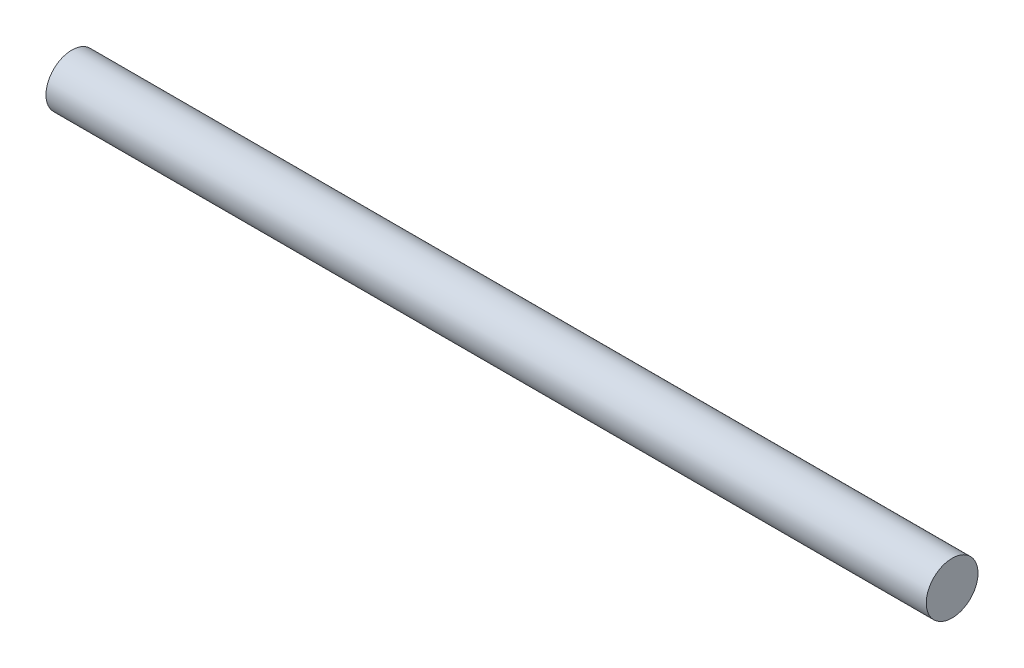
ISO-10303-21;
HEADER;
FILE_DESCRIPTION(('STEP AP214'),'2;1');
FILE_NAME('part.step','',(''),(''),'','','');
FILE_SCHEMA(('AUTOMOTIVE_DESIGN { 1 0 10303 214 1 1 1 1 }'));
ENDSEC;
DATA;
#1=APPLICATION_CONTEXT('core data for automotive mechanical design processes');
#2=APPLICATION_PROTOCOL_DEFINITION('international standard','automotive_design',2000,#1);
#3=PRODUCT_CONTEXT('',#1,'mechanical');
#4=PRODUCT('Part','Part','',(#3));
#5=PRODUCT_RELATED_PRODUCT_CATEGORY('part','',(#4));
#6=PRODUCT_DEFINITION_FORMATION('','',#4);
#7=PRODUCT_DEFINITION_CONTEXT('part definition',#1,'design');
#8=PRODUCT_DEFINITION('design','',#6,#7);
#9=PRODUCT_DEFINITION_SHAPE('','',#8);
#10=(LENGTH_UNIT() NAMED_UNIT(*) SI_UNIT(.MILLI.,.METRE.));
#11=(NAMED_UNIT(*) PLANE_ANGLE_UNIT() SI_UNIT($,.RADIAN.));
#12=(NAMED_UNIT(*) SI_UNIT($,.STERADIAN.) SOLID_ANGLE_UNIT());
#13=UNCERTAINTY_MEASURE_WITH_UNIT(LENGTH_MEASURE(1.E-05),#10,'distance_accuracy_value','');
#14=(GEOMETRIC_REPRESENTATION_CONTEXT(3) GLOBAL_UNCERTAINTY_ASSIGNED_CONTEXT((#13)) GLOBAL_UNIT_ASSIGNED_CONTEXT((#10,
#11,#12)) REPRESENTATION_CONTEXT('',''));
#15=CARTESIAN_POINT('',(0.,0.,0.));
#16=DIRECTION('',(0.,0.,1.));
#17=DIRECTION('',(1.,0.,0.));
#18=AXIS2_PLACEMENT_3D('',#15,#16,#17);
#19=CARTESIAN_POINT('',(86.36,0.,0.));
#20=DIRECTION('',(-1.,0.,0.));
#21=DIRECTION('',(0.,0.,1.));
#22=AXIS2_PLACEMENT_3D('',#19,#20,#21);
#23=CYLINDRICAL_SURFACE('',#22,2.54);
#24=CARTESIAN_POINT('',(86.36,0.,0.));
#25=DIRECTION('',(1.,0.,0.));
#26=DIRECTION('',(0.,0.,-1.));
#27=AXIS2_PLACEMENT_3D('',#24,#25,#26);
#28=CIRCLE('',#27,2.54);
#29=CARTESIAN_POINT('',(86.36,0.,-2.54));
#30=VERTEX_POINT('',#29);
#31=EDGE_CURVE('E10',#30,#30,#28,.T.);
#32=ORIENTED_EDGE('',*,*,#31,.F.);
#33=EDGE_LOOP('',(#32));
#34=FACE_BOUND('',#33,.T.);
#35=CARTESIAN_POINT('',(0.,0.,0.));
#36=DIRECTION('',(1.,0.,0.));
#37=DIRECTION('',(0.,0.,-1.));
#38=AXIS2_PLACEMENT_3D('',#35,#36,#37);
#39=CIRCLE('',#38,2.54);
#40=CARTESIAN_POINT('',(0.,0.,-2.54));
#41=VERTEX_POINT('',#40);
#42=EDGE_CURVE('E40',#41,#41,#39,.T.);
#43=ORIENTED_EDGE('',*,*,#42,.T.);
#44=EDGE_LOOP('',(#43));
#45=FACE_BOUND('',#44,.T.);
#46=ADVANCED_FACE('F37',(#34,#45),#23,.T.);
#47=CARTESIAN_POINT('',(86.36,0.,0.));
#48=DIRECTION('',(1.,0.,0.));
#49=DIRECTION('',(0.,0.,-1.));
#50=AXIS2_PLACEMENT_3D('',#47,#48,#49);
#51=PLANE('',#50);
#52=ORIENTED_EDGE('',*,*,#31,.T.);
#53=EDGE_LOOP('',(#52));
#54=FACE_BOUND('',#53,.T.);
#55=ADVANCED_FACE('F54',(#54),#51,.T.);
#56=CARTESIAN_POINT('',(0.,0.,0.));
#57=DIRECTION('',(1.,0.,0.));
#58=DIRECTION('',(0.,0.,-1.));
#59=AXIS2_PLACEMENT_3D('',#56,#57,#58);
#60=PLANE('',#59);
#61=ORIENTED_EDGE('',*,*,#42,.F.);
#62=EDGE_LOOP('',(#61));
#63=FACE_BOUND('',#62,.T.);
#64=ADVANCED_FACE('F52',(#63),#60,.F.);
#65=CLOSED_SHELL('',(#46,#55,#64));
#66=MANIFOLD_SOLID_BREP('B2',#65);
#67=ADVANCED_BREP_SHAPE_REPRESENTATION('',(#18,#66),#14);
#68=SHAPE_DEFINITION_REPRESENTATION(#9,#67);
ENDSEC;
END-ISO-10303-21;
